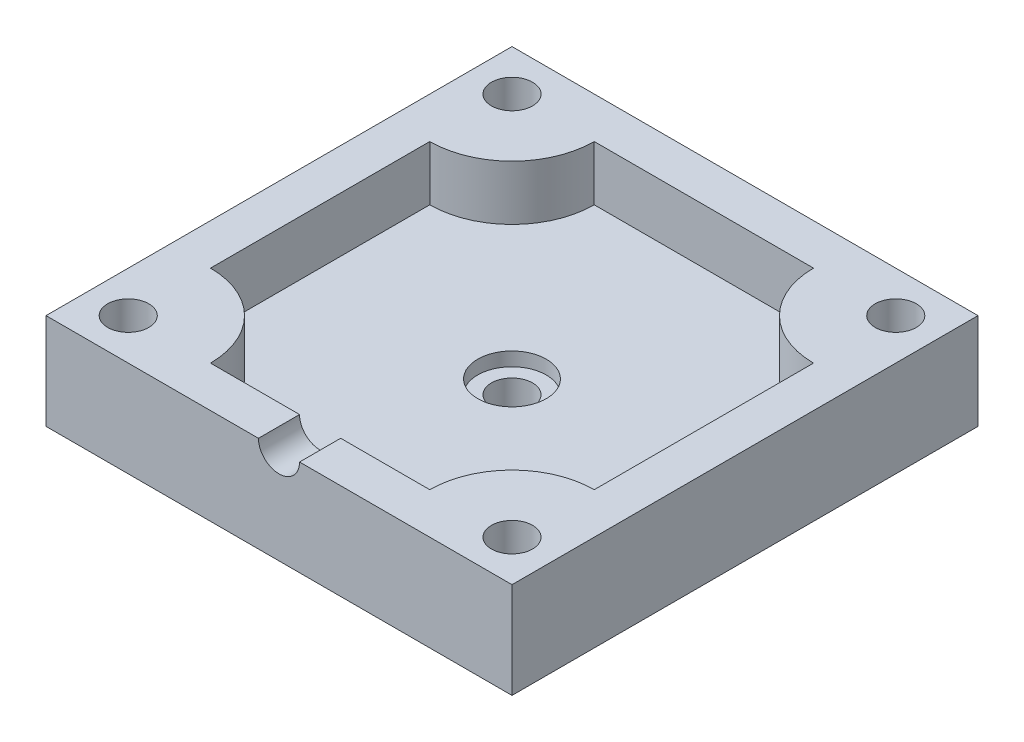
ISO-10303-21;
HEADER;
FILE_DESCRIPTION(('STEP AP214'),'2;1');
FILE_NAME('part.step','',(''),(''),'','','');
FILE_SCHEMA(('AUTOMOTIVE_DESIGN { 1 0 10303 214 1 1 1 1 }'));
ENDSEC;
DATA;
#1=APPLICATION_CONTEXT('core data for automotive mechanical design processes');
#2=APPLICATION_PROTOCOL_DEFINITION('international standard','automotive_design',2000,#1);
#3=PRODUCT_CONTEXT('',#1,'mechanical');
#4=PRODUCT('Part','Part','',(#3));
#5=PRODUCT_RELATED_PRODUCT_CATEGORY('part','',(#4));
#6=PRODUCT_DEFINITION_FORMATION('','',#4);
#7=PRODUCT_DEFINITION_CONTEXT('part definition',#1,'design');
#8=PRODUCT_DEFINITION('design','',#6,#7);
#9=PRODUCT_DEFINITION_SHAPE('','',#8);
#10=(LENGTH_UNIT() NAMED_UNIT(*) SI_UNIT(.MILLI.,.METRE.));
#11=(NAMED_UNIT(*) PLANE_ANGLE_UNIT() SI_UNIT($,.RADIAN.));
#12=(NAMED_UNIT(*) SI_UNIT($,.STERADIAN.) SOLID_ANGLE_UNIT());
#13=UNCERTAINTY_MEASURE_WITH_UNIT(LENGTH_MEASURE(1.E-05),#10,'distance_accuracy_value','');
#14=(GEOMETRIC_REPRESENTATION_CONTEXT(3) GLOBAL_UNCERTAINTY_ASSIGNED_CONTEXT((#13)) GLOBAL_UNIT_ASSIGNED_CONTEXT((#10,
#11,#12)) REPRESENTATION_CONTEXT('',''));
#15=CARTESIAN_POINT('',(0.,0.,0.));
#16=DIRECTION('',(0.,0.,1.));
#17=DIRECTION('',(1.,0.,0.));
#18=AXIS2_PLACEMENT_3D('',#15,#16,#17);
#19=CARTESIAN_POINT('',(0.,-7.,0.));
#20=DIRECTION('',(0.,1.,0.));
#21=DIRECTION('',(0.,0.,1.));
#22=AXIS2_PLACEMENT_3D('',#19,#20,#21);
#23=CYLINDRICAL_SURFACE('',#22,1.5);
#24=CARTESIAN_POINT('',(0.,0.,0.));
#25=DIRECTION('',(0.,1.,0.));
#26=DIRECTION('',(0.,0.,1.));
#27=AXIS2_PLACEMENT_3D('',#24,#25,#26);
#28=CIRCLE('',#27,1.5);
#29=CARTESIAN_POINT('',(0.,0.,1.5));
#30=VERTEX_POINT('',#29);
#31=EDGE_CURVE('E379',#30,#30,#28,.T.);
#32=ORIENTED_EDGE('',*,*,#31,.F.);
#33=EDGE_LOOP('',(#32));
#34=FACE_BOUND('',#33,.T.);
#35=CARTESIAN_POINT('',(0.,2.,0.));
#36=DIRECTION('',(0.,1.,0.));
#37=DIRECTION('',(0.,0.,1.));
#38=AXIS2_PLACEMENT_3D('',#35,#36,#37);
#39=CIRCLE('',#38,1.5);
#40=CARTESIAN_POINT('',(0.,2.,1.5));
#41=VERTEX_POINT('',#40);
#42=EDGE_CURVE('E47',#41,#41,#39,.F.);
#43=ORIENTED_EDGE('',*,*,#42,.F.);
#44=EDGE_LOOP('',(#43));
#45=FACE_BOUND('',#44,.T.);
#46=ADVANCED_FACE('F43',(#34,#45),#23,.F.);
#47=CARTESIAN_POINT('',(17.,7.,-17.));
#48=DIRECTION('',(-1.,0.,0.));
#49=DIRECTION('',(0.,0.,1.));
#50=AXIS2_PLACEMENT_3D('',#47,#48,#49);
#51=PLANE('',#50);
#52=DIRECTION('',(0.,0.,-1.));
#53=VECTOR('',#52,1.);
#54=CARTESIAN_POINT('',(17.,0.,-17.));
#55=LINE('',#54,#53);
#56=CARTESIAN_POINT('',(17.,0.,17.));
#57=VERTEX_POINT('',#56);
#58=CARTESIAN_POINT('',(17.,0.,-17.));
#59=VERTEX_POINT('',#58);
#60=EDGE_CURVE('E179',#57,#59,#55,.T.);
#61=ORIENTED_EDGE('',*,*,#60,.T.);
#62=DIRECTION('',(0.,-1.,0.));
#63=VECTOR('',#62,1.);
#64=CARTESIAN_POINT('',(17.,7.,-17.));
#65=LINE('',#64,#63);
#66=CARTESIAN_POINT('',(17.,7.,-17.));
#67=VERTEX_POINT('',#66);
#68=EDGE_CURVE('E53',#67,#59,#65,.T.);
#69=ORIENTED_EDGE('',*,*,#68,.F.);
#70=DIRECTION('',(0.,0.,-1.));
#71=VECTOR('',#70,1.);
#72=CARTESIAN_POINT('',(17.,7.,-17.));
#73=LINE('',#72,#71);
#74=CARTESIAN_POINT('',(17.,7.,17.));
#75=VERTEX_POINT('',#74);
#76=EDGE_CURVE('E193',#75,#67,#73,.T.);
#77=ORIENTED_EDGE('',*,*,#76,.F.);
#78=DIRECTION('',(0.,-1.,0.));
#79=VECTOR('',#78,1.);
#80=CARTESIAN_POINT('',(17.,7.,17.));
#81=LINE('',#80,#79);
#82=EDGE_CURVE('E167',#75,#57,#81,.T.);
#83=ORIENTED_EDGE('',*,*,#82,.T.);
#84=EDGE_LOOP('',(#61,#69,#77,#83));
#85=FACE_BOUND('',#84,.T.);
#86=ADVANCED_FACE('F45',(#85),#51,.F.);
#87=CARTESIAN_POINT('',(-17.,7.,-17.));
#88=DIRECTION('',(0.,0.,1.));
#89=DIRECTION('',(1.,0.,0.));
#90=AXIS2_PLACEMENT_3D('',#87,#88,#89);
#91=PLANE('',#90);
#92=DIRECTION('',(-1.,0.,0.));
#93=VECTOR('',#92,1.);
#94=CARTESIAN_POINT('',(-17.,0.,-17.));
#95=LINE('',#94,#93);
#96=CARTESIAN_POINT('',(-17.,0.,-17.));
#97=VERTEX_POINT('',#96);
#98=EDGE_CURVE('E183',#59,#97,#95,.T.);
#99=ORIENTED_EDGE('',*,*,#98,.T.);
#100=DIRECTION('',(0.,-1.,0.));
#101=VECTOR('',#100,1.);
#102=CARTESIAN_POINT('',(-17.,7.,-17.));
#103=LINE('',#102,#101);
#104=CARTESIAN_POINT('',(-17.,7.,-17.));
#105=VERTEX_POINT('',#104);
#106=EDGE_CURVE('E200',#105,#97,#103,.T.);
#107=ORIENTED_EDGE('',*,*,#106,.F.);
#108=DIRECTION('',(-1.,0.,0.));
#109=VECTOR('',#108,1.);
#110=CARTESIAN_POINT('',(-17.,7.,-17.));
#111=LINE('',#110,#109);
#112=EDGE_CURVE('E175',#67,#105,#111,.T.);
#113=ORIENTED_EDGE('',*,*,#112,.F.);
#114=ORIENTED_EDGE('',*,*,#68,.T.);
#115=EDGE_LOOP('',(#99,#107,#113,#114));
#116=FACE_BOUND('',#115,.T.);
#117=ADVANCED_FACE('F250',(#116),#91,.F.);
#118=CARTESIAN_POINT('',(-17.,7.,-17.));
#119=DIRECTION('',(1.,0.,0.));
#120=DIRECTION('',(0.,0.,-1.));
#121=AXIS2_PLACEMENT_3D('',#118,#119,#120);
#122=PLANE('',#121);
#123=DIRECTION('',(0.,0.,1.));
#124=VECTOR('',#123,1.);
#125=CARTESIAN_POINT('',(-17.,0.,-17.));
#126=LINE('',#125,#124);
#127=CARTESIAN_POINT('',(-17.,0.,17.));
#128=VERTEX_POINT('',#127);
#129=EDGE_CURVE('E187',#97,#128,#126,.T.);
#130=ORIENTED_EDGE('',*,*,#129,.T.);
#131=DIRECTION('',(0.,-1.,0.));
#132=VECTOR('',#131,1.);
#133=CARTESIAN_POINT('',(-17.,7.,17.));
#134=LINE('',#133,#132);
#135=CARTESIAN_POINT('',(-17.,7.,17.));
#136=VERTEX_POINT('',#135);
#137=EDGE_CURVE('E196',#136,#128,#134,.T.);
#138=ORIENTED_EDGE('',*,*,#137,.F.);
#139=DIRECTION('',(0.,0.,1.));
#140=VECTOR('',#139,1.);
#141=CARTESIAN_POINT('',(-17.,7.,-17.));
#142=LINE('',#141,#140);
#143=EDGE_CURVE('E171',#105,#136,#142,.T.);
#144=ORIENTED_EDGE('',*,*,#143,.F.);
#145=ORIENTED_EDGE('',*,*,#106,.T.);
#146=EDGE_LOOP('',(#130,#138,#144,#145));
#147=FACE_BOUND('',#146,.T.);
#148=ADVANCED_FACE('F462',(#147),#122,.F.);
#149=CARTESIAN_POINT('',(-17.,7.,17.));
#150=DIRECTION('',(0.,0.,-1.));
#151=DIRECTION('',(-1.,0.,0.));
#152=AXIS2_PLACEMENT_3D('',#149,#150,#151);
#153=PLANE('',#152);
#154=DIRECTION('',(1.,0.,0.));
#155=VECTOR('',#154,1.);
#156=CARTESIAN_POINT('',(-17.,7.,17.));
#157=LINE('',#156,#155);
#158=CARTESIAN_POINT('',(1.5,7.,17.));
#159=VERTEX_POINT('',#158);
#160=EDGE_CURVE('E159',#159,#75,#157,.T.);
#161=ORIENTED_EDGE('',*,*,#160,.F.);
#162=CARTESIAN_POINT('',(0.,7.,17.));
#163=DIRECTION('',(0.,0.,1.));
#164=DIRECTION('',(1.,0.,0.));
#165=AXIS2_PLACEMENT_3D('',#162,#163,#164);
#166=CIRCLE('',#165,1.5);
#167=CARTESIAN_POINT('',(-1.50000000000001,7.,17.));
#168=VERTEX_POINT('',#167);
#169=EDGE_CURVE('E144',#168,#159,#166,.T.);
#170=ORIENTED_EDGE('',*,*,#169,.F.);
#171=EDGE_CURVE('E170',#136,#168,#157,.T.);
#172=ORIENTED_EDGE('',*,*,#171,.F.);
#173=ORIENTED_EDGE('',*,*,#137,.T.);
#174=DIRECTION('',(1.,0.,0.));
#175=VECTOR('',#174,1.);
#176=CARTESIAN_POINT('',(-17.,0.,17.));
#177=LINE('',#176,#175);
#178=EDGE_CURVE('E190',#128,#57,#177,.T.);
#179=ORIENTED_EDGE('',*,*,#178,.T.);
#180=ORIENTED_EDGE('',*,*,#82,.F.);
#181=EDGE_LOOP('',(#161,#170,#172,#173,#179,#180));
#182=FACE_BOUND('',#181,.T.);
#183=ADVANCED_FACE('F165',(#182),#153,.F.);
#184=CARTESIAN_POINT('',(0.,7.,0.));
#185=DIRECTION('',(0.,1.,0.));
#186=DIRECTION('',(0.,0.,1.));
#187=AXIS2_PLACEMENT_3D('',#184,#185,#186);
#188=PLANE('',#187);
#189=CARTESIAN_POINT('',(-13.9999999999997,7.,14.));
#190=DIRECTION('',(0.,1.,0.));
#191=DIRECTION('',(0.,0.,1.));
#192=AXIS2_PLACEMENT_3D('',#189,#190,#191);
#193=CIRCLE('',#192,1.5);
#194=CARTESIAN_POINT('',(-13.9999999999997,7.,15.5));
#195=VERTEX_POINT('',#194);
#196=EDGE_CURVE('E375',#195,#195,#193,.T.);
#197=ORIENTED_EDGE('',*,*,#196,.F.);
#198=EDGE_LOOP('',(#197));
#199=FACE_BOUND('',#198,.T.);
#200=CARTESIAN_POINT('',(14.0000000000003,7.,14.));
#201=DIRECTION('',(0.,1.,0.));
#202=DIRECTION('',(0.,0.,1.));
#203=AXIS2_PLACEMENT_3D('',#200,#201,#202);
#204=CIRCLE('',#203,1.5);
#205=CARTESIAN_POINT('',(14.0000000000003,7.,15.5));
#206=VERTEX_POINT('',#205);
#207=EDGE_CURVE('E378',#206,#206,#204,.T.);
#208=ORIENTED_EDGE('',*,*,#207,.F.);
#209=EDGE_LOOP('',(#208));
#210=FACE_BOUND('',#209,.T.);
#211=CARTESIAN_POINT('',(14.,7.,-14.));
#212=DIRECTION('',(0.,1.,0.));
#213=DIRECTION('',(0.,0.,1.));
#214=AXIS2_PLACEMENT_3D('',#211,#212,#213);
#215=CIRCLE('',#214,1.5);
#216=CARTESIAN_POINT('',(14.,7.,-12.5));
#217=VERTEX_POINT('',#216);
#218=EDGE_CURVE('E266',#217,#217,#215,.T.);
#219=ORIENTED_EDGE('',*,*,#218,.F.);
#220=EDGE_LOOP('',(#219));
#221=FACE_BOUND('',#220,.T.);
#222=CARTESIAN_POINT('',(-14.,7.,-14.));
#223=DIRECTION('',(0.,1.,0.));
#224=DIRECTION('',(0.,0.,1.));
#225=AXIS2_PLACEMENT_3D('',#222,#223,#224);
#226=CIRCLE('',#225,1.5);
#227=CARTESIAN_POINT('',(-14.,7.,-12.5));
#228=VERTEX_POINT('',#227);
#229=EDGE_CURVE('E212',#228,#228,#226,.T.);
#230=ORIENTED_EDGE('',*,*,#229,.F.);
#231=EDGE_LOOP('',(#230));
#232=FACE_BOUND('',#231,.T.);
#233=DIRECTION('',(0.,0.,1.));
#234=VECTOR('',#233,1.);
#235=CARTESIAN_POINT('',(-1.50000000000001,7.,7.));
#236=LINE('',#235,#234);
#237=CARTESIAN_POINT('',(-1.50000000000001,7.,14.));
#238=VERTEX_POINT('',#237);
#239=EDGE_CURVE('E147',#238,#168,#236,.T.);
#240=ORIENTED_EDGE('',*,*,#239,.F.);
#241=DIRECTION('',(1.,0.,0.));
#242=VECTOR('',#241,1.);
#243=CARTESIAN_POINT('',(8.00000000000029,7.,14.));
#244=LINE('',#243,#242);
#245=CARTESIAN_POINT('',(-7.99999999999971,7.,14.));
#246=VERTEX_POINT('',#245);
#247=EDGE_CURVE('E318',#246,#238,#244,.T.);
#248=ORIENTED_EDGE('',*,*,#247,.F.);
#249=CARTESIAN_POINT('',(-13.9999999999997,7.,14.));
#250=DIRECTION('',(0.,-1.,0.));
#251=DIRECTION('',(0.,0.,1.));
#252=AXIS2_PLACEMENT_3D('',#249,#250,#251);
#253=CIRCLE('',#252,6.);
#254=CARTESIAN_POINT('',(-14.,7.,8.));
#255=VERTEX_POINT('',#254);
#256=EDGE_CURVE('E322',#255,#246,#253,.T.);
#257=ORIENTED_EDGE('',*,*,#256,.F.);
#258=DIRECTION('',(0.,0.,1.));
#259=VECTOR('',#258,1.);
#260=CARTESIAN_POINT('',(-14.,7.,-8.));
#261=LINE('',#260,#259);
#262=CARTESIAN_POINT('',(-14.,7.,-8.));
#263=VERTEX_POINT('',#262);
#264=EDGE_CURVE('E326',#263,#255,#261,.T.);
#265=ORIENTED_EDGE('',*,*,#264,.F.);
#266=CARTESIAN_POINT('',(-14.,7.,-14.));
#267=DIRECTION('',(0.,-1.,0.));
#268=DIRECTION('',(0.,0.,1.));
#269=AXIS2_PLACEMENT_3D('',#266,#267,#268);
#270=CIRCLE('',#269,6.);
#271=CARTESIAN_POINT('',(-8.,7.,-14.));
#272=VERTEX_POINT('',#271);
#273=EDGE_CURVE('E330',#272,#263,#270,.T.);
#274=ORIENTED_EDGE('',*,*,#273,.F.);
#275=DIRECTION('',(-1.,0.,0.));
#276=VECTOR('',#275,1.);
#277=CARTESIAN_POINT('',(8.,7.,-14.));
#278=LINE('',#277,#276);
#279=CARTESIAN_POINT('',(8.,7.,-14.));
#280=VERTEX_POINT('',#279);
#281=EDGE_CURVE('E334',#280,#272,#278,.T.);
#282=ORIENTED_EDGE('',*,*,#281,.F.);
#283=CARTESIAN_POINT('',(14.,7.,-14.));
#284=DIRECTION('',(0.,-1.,0.));
#285=DIRECTION('',(0.,0.,1.));
#286=AXIS2_PLACEMENT_3D('',#283,#284,#285);
#287=CIRCLE('',#286,6.);
#288=CARTESIAN_POINT('',(14.,7.,-8.));
#289=VERTEX_POINT('',#288);
#290=EDGE_CURVE('E68',#289,#280,#287,.T.);
#291=ORIENTED_EDGE('',*,*,#290,.F.);
#292=DIRECTION('',(0.,0.,-1.));
#293=VECTOR('',#292,1.);
#294=CARTESIAN_POINT('',(14.,7.,-8.));
#295=LINE('',#294,#293);
#296=CARTESIAN_POINT('',(14.,7.,8.));
#297=VERTEX_POINT('',#296);
#298=EDGE_CURVE('E309',#297,#289,#295,.T.);
#299=ORIENTED_EDGE('',*,*,#298,.F.);
#300=CARTESIAN_POINT('',(14.0000000000003,7.,14.));
#301=DIRECTION('',(0.,-1.,0.));
#302=DIRECTION('',(0.,0.,1.));
#303=AXIS2_PLACEMENT_3D('',#300,#301,#302);
#304=CIRCLE('',#303,6.);
#305=CARTESIAN_POINT('',(8.00000000000029,7.,14.));
#306=VERTEX_POINT('',#305);
#307=EDGE_CURVE('E314',#306,#297,#304,.T.);
#308=ORIENTED_EDGE('',*,*,#307,.F.);
#309=CARTESIAN_POINT('',(1.5,7.,14.));
#310=VERTEX_POINT('',#309);
#311=EDGE_CURVE('E162',#310,#306,#244,.T.);
#312=ORIENTED_EDGE('',*,*,#311,.F.);
#313=DIRECTION('',(0.,0.,1.));
#314=VECTOR('',#313,1.);
#315=CARTESIAN_POINT('',(1.5,7.,7.));
#316=LINE('',#315,#314);
#317=EDGE_CURVE('E61',#159,#310,#316,.F.);
#318=ORIENTED_EDGE('',*,*,#317,.F.);
#319=ORIENTED_EDGE('',*,*,#160,.T.);
#320=ORIENTED_EDGE('',*,*,#76,.T.);
#321=ORIENTED_EDGE('',*,*,#112,.T.);
#322=ORIENTED_EDGE('',*,*,#143,.T.);
#323=ORIENTED_EDGE('',*,*,#171,.T.);
#324=EDGE_LOOP('',(#240,#248,#257,#265,#274,#282,#291,#299,#308,#312,#318,#319,#320,#321,#322,#323));
#325=FACE_BOUND('',#324,.T.);
#326=ADVANCED_FACE('F157',(#199,#210,#221,#232,#325),#188,.T.);
#327=CARTESIAN_POINT('',(0.,0.,0.));
#328=DIRECTION('',(0.,1.,0.));
#329=DIRECTION('',(0.,0.,1.));
#330=AXIS2_PLACEMENT_3D('',#327,#328,#329);
#331=PLANE('',#330);
#332=ORIENTED_EDGE('',*,*,#31,.T.);
#333=EDGE_LOOP('',(#332));
#334=FACE_BOUND('',#333,.T.);
#335=CARTESIAN_POINT('',(-13.9999999999997,0.,14.));
#336=DIRECTION('',(0.,1.,0.));
#337=DIRECTION('',(0.,0.,1.));
#338=AXIS2_PLACEMENT_3D('',#335,#336,#337);
#339=CIRCLE('',#338,1.5);
#340=CARTESIAN_POINT('',(-13.9999999999997,0.,15.5));
#341=VERTEX_POINT('',#340);
#342=EDGE_CURVE('E153',#341,#341,#339,.T.);
#343=ORIENTED_EDGE('',*,*,#342,.T.);
#344=EDGE_LOOP('',(#343));
#345=FACE_BOUND('',#344,.T.);
#346=CARTESIAN_POINT('',(14.0000000000003,0.,14.));
#347=DIRECTION('',(0.,1.,0.));
#348=DIRECTION('',(0.,0.,1.));
#349=AXIS2_PLACEMENT_3D('',#346,#347,#348);
#350=CIRCLE('',#349,1.5);
#351=CARTESIAN_POINT('',(14.0000000000003,0.,15.5));
#352=VERTEX_POINT('',#351);
#353=EDGE_CURVE('E216',#352,#352,#350,.T.);
#354=ORIENTED_EDGE('',*,*,#353,.T.);
#355=EDGE_LOOP('',(#354));
#356=FACE_BOUND('',#355,.T.);
#357=CARTESIAN_POINT('',(14.,0.,-14.));
#358=DIRECTION('',(0.,1.,0.));
#359=DIRECTION('',(0.,0.,1.));
#360=AXIS2_PLACEMENT_3D('',#357,#358,#359);
#361=CIRCLE('',#360,1.5);
#362=CARTESIAN_POINT('',(14.,0.,-12.5));
#363=VERTEX_POINT('',#362);
#364=EDGE_CURVE('E211',#363,#363,#361,.T.);
#365=ORIENTED_EDGE('',*,*,#364,.T.);
#366=EDGE_LOOP('',(#365));
#367=FACE_BOUND('',#366,.T.);
#368=CARTESIAN_POINT('',(-14.,0.,-14.));
#369=DIRECTION('',(0.,1.,0.));
#370=DIRECTION('',(0.,0.,1.));
#371=AXIS2_PLACEMENT_3D('',#368,#369,#370);
#372=CIRCLE('',#371,1.5);
#373=CARTESIAN_POINT('',(-14.,0.,-12.5));
#374=VERTEX_POINT('',#373);
#375=EDGE_CURVE('E207',#374,#374,#372,.T.);
#376=ORIENTED_EDGE('',*,*,#375,.T.);
#377=EDGE_LOOP('',(#376));
#378=FACE_BOUND('',#377,.T.);
#379=ORIENTED_EDGE('',*,*,#60,.F.);
#380=ORIENTED_EDGE('',*,*,#178,.F.);
#381=ORIENTED_EDGE('',*,*,#129,.F.);
#382=ORIENTED_EDGE('',*,*,#98,.F.);
#383=EDGE_LOOP('',(#379,#380,#381,#382));
#384=FACE_BOUND('',#383,.T.);
#385=ADVANCED_FACE('F223',(#334,#345,#356,#367,#378,#384),#331,.F.);
#386=CARTESIAN_POINT('',(14.,3.,-14.));
#387=DIRECTION('',(0.,1.,0.));
#388=DIRECTION('',(0.,0.,1.));
#389=AXIS2_PLACEMENT_3D('',#386,#387,#388);
#390=CYLINDRICAL_SURFACE('',#389,6.);
#391=ORIENTED_EDGE('',*,*,#290,.T.);
#392=DIRECTION('',(0.,1.,0.));
#393=VECTOR('',#392,1.);
#394=CARTESIAN_POINT('',(8.,3.,-14.));
#395=LINE('',#394,#393);
#396=CARTESIAN_POINT('',(8.,3.,-14.));
#397=VERTEX_POINT('',#396);
#398=EDGE_CURVE('E284',#397,#280,#395,.T.);
#399=ORIENTED_EDGE('',*,*,#398,.F.);
#400=CARTESIAN_POINT('',(14.,3.,-14.));
#401=DIRECTION('',(0.,-1.,0.));
#402=DIRECTION('',(0.,0.,1.));
#403=AXIS2_PLACEMENT_3D('',#400,#401,#402);
#404=CIRCLE('',#403,6.);
#405=CARTESIAN_POINT('',(14.,3.,-8.));
#406=VERTEX_POINT('',#405);
#407=EDGE_CURVE('E313',#406,#397,#404,.T.);
#408=ORIENTED_EDGE('',*,*,#407,.F.);
#409=DIRECTION('',(0.,1.,0.));
#410=VECTOR('',#409,1.);
#411=CARTESIAN_POINT('',(14.,3.,-8.));
#412=LINE('',#411,#410);
#413=EDGE_CURVE('E184',#406,#289,#412,.T.);
#414=ORIENTED_EDGE('',*,*,#413,.T.);
#415=EDGE_LOOP('',(#391,#399,#408,#414));
#416=FACE_BOUND('',#415,.T.);
#417=ADVANCED_FACE('F271',(#416),#390,.T.);
#418=CARTESIAN_POINT('',(14.,3.,-8.));
#419=DIRECTION('',(1.,0.,0.));
#420=DIRECTION('',(0.,0.,-1.));
#421=AXIS2_PLACEMENT_3D('',#418,#419,#420);
#422=PLANE('',#421);
#423=ORIENTED_EDGE('',*,*,#298,.T.);
#424=ORIENTED_EDGE('',*,*,#413,.F.);
#425=DIRECTION('',(0.,0.,-1.));
#426=VECTOR('',#425,1.);
#427=CARTESIAN_POINT('',(14.,3.,-8.));
#428=LINE('',#427,#426);
#429=CARTESIAN_POINT('',(14.,3.,8.));
#430=VERTEX_POINT('',#429);
#431=EDGE_CURVE('E288',#430,#406,#428,.T.);
#432=ORIENTED_EDGE('',*,*,#431,.F.);
#433=DIRECTION('',(0.,1.,0.));
#434=VECTOR('',#433,1.);
#435=CARTESIAN_POINT('',(14.,3.,8.));
#436=LINE('',#435,#434);
#437=EDGE_CURVE('E304',#430,#297,#436,.T.);
#438=ORIENTED_EDGE('',*,*,#437,.T.);
#439=EDGE_LOOP('',(#423,#424,#432,#438));
#440=FACE_BOUND('',#439,.T.);
#441=ADVANCED_FACE('F434',(#440),#422,.F.);
#442=CARTESIAN_POINT('',(14.0000000000003,3.,14.));
#443=DIRECTION('',(0.,1.,0.));
#444=DIRECTION('',(0.,0.,1.));
#445=AXIS2_PLACEMENT_3D('',#442,#443,#444);
#446=CYLINDRICAL_SURFACE('',#445,6.);
#447=ORIENTED_EDGE('',*,*,#307,.T.);
#448=ORIENTED_EDGE('',*,*,#437,.F.);
#449=CARTESIAN_POINT('',(14.0000000000003,3.,14.));
#450=DIRECTION('',(0.,-1.,0.));
#451=DIRECTION('',(0.,0.,1.));
#452=AXIS2_PLACEMENT_3D('',#449,#450,#451);
#453=CIRCLE('',#452,6.);
#454=CARTESIAN_POINT('',(8.00000000000029,3.,14.));
#455=VERTEX_POINT('',#454);
#456=EDGE_CURVE('E343',#455,#430,#453,.T.);
#457=ORIENTED_EDGE('',*,*,#456,.F.);
#458=DIRECTION('',(0.,1.,0.));
#459=VECTOR('',#458,1.);
#460=CARTESIAN_POINT('',(8.00000000000029,3.,14.));
#461=LINE('',#460,#459);
#462=EDGE_CURVE('E300',#455,#306,#461,.T.);
#463=ORIENTED_EDGE('',*,*,#462,.T.);
#464=EDGE_LOOP('',(#447,#448,#457,#463));
#465=FACE_BOUND('',#464,.T.);
#466=ADVANCED_FACE('F437',(#465),#446,.T.);
#467=CARTESIAN_POINT('',(8.00000000000029,3.,14.));
#468=DIRECTION('',(0.,0.,1.));
#469=DIRECTION('',(1.,0.,0.));
#470=AXIS2_PLACEMENT_3D('',#467,#468,#469);
#471=PLANE('',#470);
#472=ORIENTED_EDGE('',*,*,#247,.T.);
#473=CARTESIAN_POINT('',(0.,7.,14.));
#474=DIRECTION('',(0.,0.,1.));
#475=DIRECTION('',(1.,0.,0.));
#476=AXIS2_PLACEMENT_3D('',#473,#474,#475);
#477=CIRCLE('',#476,1.5);
#478=EDGE_CURVE('E11',#238,#310,#477,.T.);
#479=ORIENTED_EDGE('',*,*,#478,.T.);
#480=ORIENTED_EDGE('',*,*,#311,.T.);
#481=ORIENTED_EDGE('',*,*,#462,.F.);
#482=DIRECTION('',(1.,0.,0.));
#483=VECTOR('',#482,1.);
#484=CARTESIAN_POINT('',(8.00000000000029,3.,14.));
#485=LINE('',#484,#483);
#486=CARTESIAN_POINT('',(-7.99999999999971,3.,14.));
#487=VERTEX_POINT('',#486);
#488=EDGE_CURVE('E347',#487,#455,#485,.T.);
#489=ORIENTED_EDGE('',*,*,#488,.F.);
#490=DIRECTION('',(0.,1.,0.));
#491=VECTOR('',#490,1.);
#492=CARTESIAN_POINT('',(-7.99999999999971,3.,14.));
#493=LINE('',#492,#491);
#494=EDGE_CURVE('E297',#487,#246,#493,.T.);
#495=ORIENTED_EDGE('',*,*,#494,.T.);
#496=EDGE_LOOP('',(#472,#479,#480,#481,#489,#495));
#497=FACE_BOUND('',#496,.T.);
#498=ADVANCED_FACE('F430',(#497),#471,.F.);
#499=CARTESIAN_POINT('',(-13.9999999999997,3.,14.));
#500=DIRECTION('',(0.,1.,0.));
#501=DIRECTION('',(0.,0.,1.));
#502=AXIS2_PLACEMENT_3D('',#499,#500,#501);
#503=CYLINDRICAL_SURFACE('',#502,6.);
#504=ORIENTED_EDGE('',*,*,#256,.T.);
#505=ORIENTED_EDGE('',*,*,#494,.F.);
#506=CARTESIAN_POINT('',(-13.9999999999997,3.,14.));
#507=DIRECTION('',(0.,-1.,0.));
#508=DIRECTION('',(0.,0.,1.));
#509=AXIS2_PLACEMENT_3D('',#506,#507,#508);
#510=CIRCLE('',#509,6.);
#511=CARTESIAN_POINT('',(-14.,3.,8.));
#512=VERTEX_POINT('',#511);
#513=EDGE_CURVE('E351',#512,#487,#510,.T.);
#514=ORIENTED_EDGE('',*,*,#513,.F.);
#515=DIRECTION('',(0.,1.,0.));
#516=VECTOR('',#515,1.);
#517=CARTESIAN_POINT('',(-14.,3.,8.));
#518=LINE('',#517,#516);
#519=EDGE_CURVE('E294',#512,#255,#518,.T.);
#520=ORIENTED_EDGE('',*,*,#519,.T.);
#521=EDGE_LOOP('',(#504,#505,#514,#520));
#522=FACE_BOUND('',#521,.T.);
#523=ADVANCED_FACE('F426',(#522),#503,.T.);
#524=CARTESIAN_POINT('',(-14.,3.,-8.));
#525=DIRECTION('',(-1.,0.,0.));
#526=DIRECTION('',(0.,0.,1.));
#527=AXIS2_PLACEMENT_3D('',#524,#525,#526);
#528=PLANE('',#527);
#529=ORIENTED_EDGE('',*,*,#264,.T.);
#530=ORIENTED_EDGE('',*,*,#519,.F.);
#531=DIRECTION('',(0.,0.,1.));
#532=VECTOR('',#531,1.);
#533=CARTESIAN_POINT('',(-14.,3.,-8.));
#534=LINE('',#533,#532);
#535=CARTESIAN_POINT('',(-14.,3.,-8.));
#536=VERTEX_POINT('',#535);
#537=EDGE_CURVE('E355',#536,#512,#534,.T.);
#538=ORIENTED_EDGE('',*,*,#537,.F.);
#539=DIRECTION('',(0.,1.,0.));
#540=VECTOR('',#539,1.);
#541=CARTESIAN_POINT('',(-14.,3.,-8.));
#542=LINE('',#541,#540);
#543=EDGE_CURVE('E291',#536,#263,#542,.T.);
#544=ORIENTED_EDGE('',*,*,#543,.T.);
#545=EDGE_LOOP('',(#529,#530,#538,#544));
#546=FACE_BOUND('',#545,.T.);
#547=ADVANCED_FACE('F422',(#546),#528,.F.);
#548=CARTESIAN_POINT('',(-14.,3.,-14.));
#549=DIRECTION('',(0.,1.,0.));
#550=DIRECTION('',(0.,0.,1.));
#551=AXIS2_PLACEMENT_3D('',#548,#549,#550);
#552=CYLINDRICAL_SURFACE('',#551,6.);
#553=ORIENTED_EDGE('',*,*,#273,.T.);
#554=ORIENTED_EDGE('',*,*,#543,.F.);
#555=CARTESIAN_POINT('',(-14.,3.,-14.));
#556=DIRECTION('',(0.,-1.,0.));
#557=DIRECTION('',(0.,0.,1.));
#558=AXIS2_PLACEMENT_3D('',#555,#556,#557);
#559=CIRCLE('',#558,6.);
#560=CARTESIAN_POINT('',(-8.,3.,-14.));
#561=VERTEX_POINT('',#560);
#562=EDGE_CURVE('E359',#561,#536,#559,.T.);
#563=ORIENTED_EDGE('',*,*,#562,.F.);
#564=DIRECTION('',(0.,1.,0.));
#565=VECTOR('',#564,1.);
#566=CARTESIAN_POINT('',(-8.,3.,-14.));
#567=LINE('',#566,#565);
#568=EDGE_CURVE('E287',#561,#272,#567,.T.);
#569=ORIENTED_EDGE('',*,*,#568,.T.);
#570=EDGE_LOOP('',(#553,#554,#563,#569));
#571=FACE_BOUND('',#570,.T.);
#572=ADVANCED_FACE('F418',(#571),#552,.T.);
#573=CARTESIAN_POINT('',(8.,3.,-14.));
#574=DIRECTION('',(0.,0.,-1.));
#575=DIRECTION('',(-1.,0.,0.));
#576=AXIS2_PLACEMENT_3D('',#573,#574,#575);
#577=PLANE('',#576);
#578=ORIENTED_EDGE('',*,*,#281,.T.);
#579=ORIENTED_EDGE('',*,*,#568,.F.);
#580=DIRECTION('',(-1.,0.,0.));
#581=VECTOR('',#580,1.);
#582=CARTESIAN_POINT('',(8.,3.,-14.));
#583=LINE('',#582,#581);
#584=EDGE_CURVE('E363',#397,#561,#583,.T.);
#585=ORIENTED_EDGE('',*,*,#584,.F.);
#586=ORIENTED_EDGE('',*,*,#398,.T.);
#587=EDGE_LOOP('',(#578,#579,#585,#586));
#588=FACE_BOUND('',#587,.T.);
#589=ADVANCED_FACE('F408',(#588),#577,.F.);
#590=CARTESIAN_POINT('',(14.,3.,-14.));
#591=DIRECTION('',(0.,1.,0.));
#592=DIRECTION('',(0.,0.,1.));
#593=AXIS2_PLACEMENT_3D('',#590,#591,#592);
#594=PLANE('',#593);
#595=CARTESIAN_POINT('',(0.,3.,0.));
#596=DIRECTION('',(0.,1.,0.));
#597=DIRECTION('',(0.,0.,1.));
#598=AXIS2_PLACEMENT_3D('',#595,#596,#597);
#599=CIRCLE('',#598,2.5);
#600=CARTESIAN_POINT('',(0.,3.,2.5));
#601=VERTEX_POINT('',#600);
#602=EDGE_CURVE('E388',#601,#601,#599,.T.);
#603=ORIENTED_EDGE('',*,*,#602,.F.);
#604=EDGE_LOOP('',(#603));
#605=FACE_BOUND('',#604,.T.);
#606=ORIENTED_EDGE('',*,*,#407,.T.);
#607=ORIENTED_EDGE('',*,*,#584,.T.);
#608=ORIENTED_EDGE('',*,*,#562,.T.);
#609=ORIENTED_EDGE('',*,*,#537,.T.);
#610=ORIENTED_EDGE('',*,*,#513,.T.);
#611=ORIENTED_EDGE('',*,*,#488,.T.);
#612=ORIENTED_EDGE('',*,*,#456,.T.);
#613=ORIENTED_EDGE('',*,*,#431,.T.);
#614=EDGE_LOOP('',(#606,#607,#608,#609,#610,#611,#612,#613));
#615=FACE_BOUND('',#614,.T.);
#616=ADVANCED_FACE('F405',(#605,#615),#594,.T.);
#617=CARTESIAN_POINT('',(0.,7.,7.));
#618=DIRECTION('',(0.,0.,1.));
#619=DIRECTION('',(1.,0.,0.));
#620=AXIS2_PLACEMENT_3D('',#617,#618,#619);
#621=CYLINDRICAL_SURFACE('',#620,1.5);
#622=ORIENTED_EDGE('',*,*,#239,.T.);
#623=ORIENTED_EDGE('',*,*,#169,.T.);
#624=ORIENTED_EDGE('',*,*,#317,.T.);
#625=ORIENTED_EDGE('',*,*,#478,.F.);
#626=EDGE_LOOP('',(#622,#623,#624,#625));
#627=FACE_BOUND('',#626,.T.);
#628=ADVANCED_FACE('F145',(#627),#621,.F.);
#629=CARTESIAN_POINT('',(-14.,-3.,-14.));
#630=DIRECTION('',(0.,1.,0.));
#631=DIRECTION('',(0.,0.,1.));
#632=AXIS2_PLACEMENT_3D('',#629,#630,#631);
#633=CYLINDRICAL_SURFACE('',#632,1.5);
#634=ORIENTED_EDGE('',*,*,#229,.T.);
#635=EDGE_LOOP('',(#634));
#636=FACE_BOUND('',#635,.T.);
#637=ORIENTED_EDGE('',*,*,#375,.F.);
#638=EDGE_LOOP('',(#637));
#639=FACE_BOUND('',#638,.T.);
#640=ADVANCED_FACE('F257',(#636,#639),#633,.F.);
#641=CARTESIAN_POINT('',(14.,-3.,-14.));
#642=DIRECTION('',(0.,1.,0.));
#643=DIRECTION('',(0.,0.,1.));
#644=AXIS2_PLACEMENT_3D('',#641,#642,#643);
#645=CYLINDRICAL_SURFACE('',#644,1.5);
#646=ORIENTED_EDGE('',*,*,#218,.T.);
#647=EDGE_LOOP('',(#646));
#648=FACE_BOUND('',#647,.T.);
#649=ORIENTED_EDGE('',*,*,#364,.F.);
#650=EDGE_LOOP('',(#649));
#651=FACE_BOUND('',#650,.T.);
#652=ADVANCED_FACE('F239',(#648,#651),#645,.F.);
#653=CARTESIAN_POINT('',(14.0000000000003,-3.,14.));
#654=DIRECTION('',(0.,1.,0.));
#655=DIRECTION('',(0.,0.,1.));
#656=AXIS2_PLACEMENT_3D('',#653,#654,#655);
#657=CYLINDRICAL_SURFACE('',#656,1.5);
#658=ORIENTED_EDGE('',*,*,#207,.T.);
#659=EDGE_LOOP('',(#658));
#660=FACE_BOUND('',#659,.T.);
#661=ORIENTED_EDGE('',*,*,#353,.F.);
#662=EDGE_LOOP('',(#661));
#663=FACE_BOUND('',#662,.T.);
#664=ADVANCED_FACE('F229',(#660,#663),#657,.F.);
#665=CARTESIAN_POINT('',(-13.9999999999997,-3.,14.));
#666=DIRECTION('',(0.,1.,0.));
#667=DIRECTION('',(0.,0.,1.));
#668=AXIS2_PLACEMENT_3D('',#665,#666,#667);
#669=CYLINDRICAL_SURFACE('',#668,1.5);
#670=ORIENTED_EDGE('',*,*,#196,.T.);
#671=EDGE_LOOP('',(#670));
#672=FACE_BOUND('',#671,.T.);
#673=ORIENTED_EDGE('',*,*,#342,.F.);
#674=EDGE_LOOP('',(#673));
#675=FACE_BOUND('',#674,.T.);
#676=ADVANCED_FACE('F226',(#672,#675),#669,.F.);
#677=CARTESIAN_POINT('',(0.,2.,0.));
#678=DIRECTION('',(0.,1.,0.));
#679=DIRECTION('',(0.,0.,1.));
#680=AXIS2_PLACEMENT_3D('',#677,#678,#679);
#681=PLANE('',#680);
#682=CARTESIAN_POINT('',(0.,2.,0.));
#683=DIRECTION('',(0.,1.,0.));
#684=DIRECTION('',(0.,0.,1.));
#685=AXIS2_PLACEMENT_3D('',#682,#683,#684);
#686=CIRCLE('',#685,2.5);
#687=CARTESIAN_POINT('',(0.,2.,2.5));
#688=VERTEX_POINT('',#687);
#689=EDGE_CURVE('E392',#688,#688,#686,.T.);
#690=ORIENTED_EDGE('',*,*,#689,.T.);
#691=EDGE_LOOP('',(#690));
#692=FACE_BOUND('',#691,.T.);
#693=ORIENTED_EDGE('',*,*,#42,.T.);
#694=EDGE_LOOP('',(#693));
#695=FACE_BOUND('',#694,.T.);
#696=ADVANCED_FACE('F228',(#692,#695),#681,.T.);
#697=CARTESIAN_POINT('',(0.,2.,0.));
#698=DIRECTION('',(0.,1.,0.));
#699=DIRECTION('',(0.,0.,1.));
#700=AXIS2_PLACEMENT_3D('',#697,#698,#699);
#701=CYLINDRICAL_SURFACE('',#700,2.5);
#702=ORIENTED_EDGE('',*,*,#689,.F.);
#703=EDGE_LOOP('',(#702));
#704=FACE_BOUND('',#703,.T.);
#705=ORIENTED_EDGE('',*,*,#602,.T.);
#706=EDGE_LOOP('',(#705));
#707=FACE_BOUND('',#706,.T.);
#708=ADVANCED_FACE('F236',(#704,#707),#701,.F.);
#709=CLOSED_SHELL('',(#46,#86,#117,#148,#183,#326,#385,#417,#441,#466,#498,#523,#547,#572,#589,
#616,#628,#640,#652,#664,#676,#696,#708));
#710=MANIFOLD_SOLID_BREP('B2',#709);
#711=ADVANCED_BREP_SHAPE_REPRESENTATION('',(#18,#710),#14);
#712=SHAPE_DEFINITION_REPRESENTATION(#9,#711);
ENDSEC;
END-ISO-10303-21;
